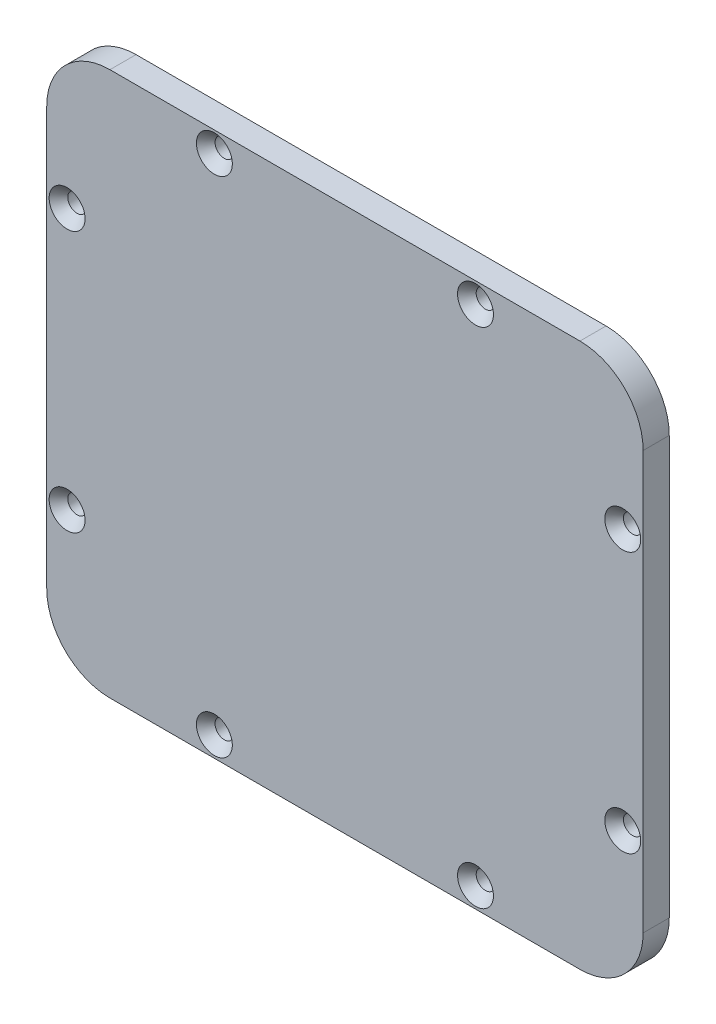
ISO-10303-21;
HEADER;
FILE_DESCRIPTION(('STEP AP214'),'2;1');
FILE_NAME('part.step','',(''),(''),'','','');
FILE_SCHEMA(('AUTOMOTIVE_DESIGN { 1 0 10303 214 1 1 1 1 }'));
ENDSEC;
DATA;
#1=APPLICATION_CONTEXT('core data for automotive mechanical design processes');
#2=APPLICATION_PROTOCOL_DEFINITION('international standard','automotive_design',2000,#1);
#3=PRODUCT_CONTEXT('',#1,'mechanical');
#4=PRODUCT('Part','Part','',(#3));
#5=PRODUCT_RELATED_PRODUCT_CATEGORY('part','',(#4));
#6=PRODUCT_DEFINITION_FORMATION('','',#4);
#7=PRODUCT_DEFINITION_CONTEXT('part definition',#1,'design');
#8=PRODUCT_DEFINITION('design','',#6,#7);
#9=PRODUCT_DEFINITION_SHAPE('','',#8);
#10=(LENGTH_UNIT() NAMED_UNIT(*) SI_UNIT(.MILLI.,.METRE.));
#11=(NAMED_UNIT(*) PLANE_ANGLE_UNIT() SI_UNIT($,.RADIAN.));
#12=(NAMED_UNIT(*) SI_UNIT($,.STERADIAN.) SOLID_ANGLE_UNIT());
#13=UNCERTAINTY_MEASURE_WITH_UNIT(LENGTH_MEASURE(1.E-05),#10,'distance_accuracy_value','');
#14=(GEOMETRIC_REPRESENTATION_CONTEXT(3) GLOBAL_UNCERTAINTY_ASSIGNED_CONTEXT((#13)) GLOBAL_UNIT_ASSIGNED_CONTEXT((#10,
#11,#12)) REPRESENTATION_CONTEXT('',''));
#15=CARTESIAN_POINT('',(0.,0.,0.));
#16=DIRECTION('',(0.,0.,1.));
#17=DIRECTION('',(1.,0.,0.));
#18=AXIS2_PLACEMENT_3D('',#15,#16,#17);
#19=CARTESIAN_POINT('',(-28.575,25.4,3.175));
#20=DIRECTION('',(0.,0.,-1.));
#21=DIRECTION('',(-1.,0.,0.));
#22=AXIS2_PLACEMENT_3D('',#19,#20,#21);
#23=CYLINDRICAL_SURFACE('',#22,7.6835);
#24=CARTESIAN_POINT('',(-28.575,25.4,0.));
#25=DIRECTION('',(0.,0.,1.));
#26=DIRECTION('',(1.,0.,0.));
#27=AXIS2_PLACEMENT_3D('',#24,#25,#26);
#28=CIRCLE('',#27,7.6835);
#29=CARTESIAN_POINT('',(-28.575,33.0835,0.));
#30=VERTEX_POINT('',#29);
#31=CARTESIAN_POINT('',(-36.2585,25.4,0.));
#32=VERTEX_POINT('',#31);
#33=EDGE_CURVE('E128',#30,#32,#28,.T.);
#34=ORIENTED_EDGE('',*,*,#33,.T.);
#35=DIRECTION('',(0.,0.,-1.));
#36=VECTOR('',#35,1.);
#37=CARTESIAN_POINT('',(-36.2585,25.4,3.175));
#38=LINE('',#37,#36);
#39=CARTESIAN_POINT('',(-36.2585,25.4,3.175));
#40=VERTEX_POINT('',#39);
#41=EDGE_CURVE('E11',#40,#32,#38,.T.);
#42=ORIENTED_EDGE('',*,*,#41,.F.);
#43=CARTESIAN_POINT('',(-28.575,25.4,3.175));
#44=DIRECTION('',(0.,0.,1.));
#45=DIRECTION('',(1.,0.,0.));
#46=AXIS2_PLACEMENT_3D('',#43,#44,#45);
#47=CIRCLE('',#46,7.6835);
#48=CARTESIAN_POINT('',(-28.575,33.0835,3.175));
#49=VERTEX_POINT('',#48);
#50=EDGE_CURVE('E143',#49,#40,#47,.T.);
#51=ORIENTED_EDGE('',*,*,#50,.F.);
#52=DIRECTION('',(0.,0.,-1.));
#53=VECTOR('',#52,1.);
#54=CARTESIAN_POINT('',(-28.575,33.0835,3.175));
#55=LINE('',#54,#53);
#56=EDGE_CURVE('E124',#49,#30,#55,.T.);
#57=ORIENTED_EDGE('',*,*,#56,.T.);
#58=EDGE_LOOP('',(#34,#42,#51,#57));
#59=FACE_BOUND('',#58,.T.);
#60=ADVANCED_FACE('F32',(#59),#23,.T.);
#61=CARTESIAN_POINT('',(-36.2585,25.4,3.175));
#62=DIRECTION('',(1.,0.,0.));
#63=DIRECTION('',(0.,1.,0.));
#64=AXIS2_PLACEMENT_3D('',#61,#62,#63);
#65=PLANE('',#64);
#66=DIRECTION('',(0.,-1.,0.));
#67=VECTOR('',#66,1.);
#68=CARTESIAN_POINT('',(-36.2585,25.4,0.));
#69=LINE('',#68,#67);
#70=CARTESIAN_POINT('',(-36.2585,-25.4,0.));
#71=VERTEX_POINT('',#70);
#72=EDGE_CURVE('E131',#32,#71,#69,.T.);
#73=ORIENTED_EDGE('',*,*,#72,.T.);
#74=DIRECTION('',(0.,0.,-1.));
#75=VECTOR('',#74,1.);
#76=CARTESIAN_POINT('',(-36.2585,-25.4,3.175));
#77=LINE('',#76,#75);
#78=CARTESIAN_POINT('',(-36.2585,-25.4,3.175));
#79=VERTEX_POINT('',#78);
#80=EDGE_CURVE('E40',#79,#71,#77,.T.);
#81=ORIENTED_EDGE('',*,*,#80,.F.);
#82=DIRECTION('',(0.,-1.,0.));
#83=VECTOR('',#82,1.);
#84=CARTESIAN_POINT('',(-36.2585,25.4,3.175));
#85=LINE('',#84,#83);
#86=EDGE_CURVE('E91',#40,#79,#85,.T.);
#87=ORIENTED_EDGE('',*,*,#86,.F.);
#88=ORIENTED_EDGE('',*,*,#41,.T.);
#89=EDGE_LOOP('',(#73,#81,#87,#88));
#90=FACE_BOUND('',#89,.T.);
#91=ADVANCED_FACE('F285',(#90),#65,.F.);
#92=CARTESIAN_POINT('',(-28.575,-25.4,3.175));
#93=DIRECTION('',(0.,0.,-1.));
#94=DIRECTION('',(-1.,0.,0.));
#95=AXIS2_PLACEMENT_3D('',#92,#93,#94);
#96=CYLINDRICAL_SURFACE('',#95,7.6835);
#97=CARTESIAN_POINT('',(-28.575,-25.4,0.));
#98=DIRECTION('',(0.,0.,1.));
#99=DIRECTION('',(1.,0.,0.));
#100=AXIS2_PLACEMENT_3D('',#97,#98,#99);
#101=CIRCLE('',#100,7.6835);
#102=CARTESIAN_POINT('',(-28.575,-33.0835,0.));
#103=VERTEX_POINT('',#102);
#104=EDGE_CURVE('E134',#71,#103,#101,.T.);
#105=ORIENTED_EDGE('',*,*,#104,.T.);
#106=DIRECTION('',(0.,0.,-1.));
#107=VECTOR('',#106,1.);
#108=CARTESIAN_POINT('',(-28.575,-33.0835,3.175));
#109=LINE('',#108,#107);
#110=CARTESIAN_POINT('',(-28.575,-33.0835,3.175));
#111=VERTEX_POINT('',#110);
#112=EDGE_CURVE('E150',#111,#103,#109,.T.);
#113=ORIENTED_EDGE('',*,*,#112,.F.);
#114=CARTESIAN_POINT('',(-28.575,-25.4,3.175));
#115=DIRECTION('',(0.,0.,1.));
#116=DIRECTION('',(1.,0.,0.));
#117=AXIS2_PLACEMENT_3D('',#114,#115,#116);
#118=CIRCLE('',#117,7.6835);
#119=EDGE_CURVE('E158',#79,#111,#118,.T.);
#120=ORIENTED_EDGE('',*,*,#119,.F.);
#121=ORIENTED_EDGE('',*,*,#80,.T.);
#122=EDGE_LOOP('',(#105,#113,#120,#121));
#123=FACE_BOUND('',#122,.T.);
#124=ADVANCED_FACE('F156',(#123),#96,.T.);
#125=CARTESIAN_POINT('',(-28.575,-33.0835,3.175));
#126=DIRECTION('',(0.,1.,0.));
#127=DIRECTION('',(-1.,0.,0.));
#128=AXIS2_PLACEMENT_3D('',#125,#126,#127);
#129=PLANE('',#128);
#130=DIRECTION('',(1.,0.,0.));
#131=VECTOR('',#130,1.);
#132=CARTESIAN_POINT('',(-28.575,-33.0835,0.));
#133=LINE('',#132,#131);
#134=CARTESIAN_POINT('',(28.575,-33.0835,0.));
#135=VERTEX_POINT('',#134);
#136=EDGE_CURVE('E136',#103,#135,#133,.T.);
#137=ORIENTED_EDGE('',*,*,#136,.T.);
#138=DIRECTION('',(0.,0.,-1.));
#139=VECTOR('',#138,1.);
#140=CARTESIAN_POINT('',(28.575,-33.0835,3.175));
#141=LINE('',#140,#139);
#142=CARTESIAN_POINT('',(28.575,-33.0835,3.175));
#143=VERTEX_POINT('',#142);
#144=EDGE_CURVE('E147',#143,#135,#141,.T.);
#145=ORIENTED_EDGE('',*,*,#144,.F.);
#146=DIRECTION('',(1.,0.,0.));
#147=VECTOR('',#146,1.);
#148=CARTESIAN_POINT('',(-28.575,-33.0835,3.175));
#149=LINE('',#148,#147);
#150=EDGE_CURVE('E170',#111,#143,#149,.T.);
#151=ORIENTED_EDGE('',*,*,#150,.F.);
#152=ORIENTED_EDGE('',*,*,#112,.T.);
#153=EDGE_LOOP('',(#137,#145,#151,#152));
#154=FACE_BOUND('',#153,.T.);
#155=ADVANCED_FACE('F166',(#154),#129,.F.);
#156=CARTESIAN_POINT('',(28.575,-25.4,3.175));
#157=DIRECTION('',(0.,0.,-1.));
#158=DIRECTION('',(-1.,0.,0.));
#159=AXIS2_PLACEMENT_3D('',#156,#157,#158);
#160=CYLINDRICAL_SURFACE('',#159,7.6835);
#161=CARTESIAN_POINT('',(28.575,-25.4,0.));
#162=DIRECTION('',(0.,0.,1.));
#163=DIRECTION('',(1.,0.,0.));
#164=AXIS2_PLACEMENT_3D('',#161,#162,#163);
#165=CIRCLE('',#164,7.6835);
#166=CARTESIAN_POINT('',(36.2585,-25.4,0.));
#167=VERTEX_POINT('',#166);
#168=EDGE_CURVE('E138',#135,#167,#165,.T.);
#169=ORIENTED_EDGE('',*,*,#168,.T.);
#170=DIRECTION('',(0.,0.,-1.));
#171=VECTOR('',#170,1.);
#172=CARTESIAN_POINT('',(36.2585,-25.4,3.175));
#173=LINE('',#172,#171);
#174=CARTESIAN_POINT('',(36.2585,-25.4,3.175));
#175=VERTEX_POINT('',#174);
#176=EDGE_CURVE('E119',#175,#167,#173,.T.);
#177=ORIENTED_EDGE('',*,*,#176,.F.);
#178=CARTESIAN_POINT('',(28.575,-25.4,3.175));
#179=DIRECTION('',(0.,0.,1.));
#180=DIRECTION('',(1.,0.,0.));
#181=AXIS2_PLACEMENT_3D('',#178,#179,#180);
#182=CIRCLE('',#181,7.6835);
#183=EDGE_CURVE('E110',#143,#175,#182,.T.);
#184=ORIENTED_EDGE('',*,*,#183,.F.);
#185=ORIENTED_EDGE('',*,*,#144,.T.);
#186=EDGE_LOOP('',(#169,#177,#184,#185));
#187=FACE_BOUND('',#186,.T.);
#188=ADVANCED_FACE('F169',(#187),#160,.T.);
#189=CARTESIAN_POINT('',(36.2585,-25.4,3.175));
#190=DIRECTION('',(-1.,0.,0.));
#191=DIRECTION('',(0.,-1.,0.));
#192=AXIS2_PLACEMENT_3D('',#189,#190,#191);
#193=PLANE('',#192);
#194=DIRECTION('',(0.,1.,0.));
#195=VECTOR('',#194,1.);
#196=CARTESIAN_POINT('',(36.2585,-25.4,0.));
#197=LINE('',#196,#195);
#198=CARTESIAN_POINT('',(36.2585,25.4,0.));
#199=VERTEX_POINT('',#198);
#200=EDGE_CURVE('E118',#167,#199,#197,.T.);
#201=ORIENTED_EDGE('',*,*,#200,.T.);
#202=DIRECTION('',(0.,0.,-1.));
#203=VECTOR('',#202,1.);
#204=CARTESIAN_POINT('',(36.2585,25.4,3.175));
#205=LINE('',#204,#203);
#206=CARTESIAN_POINT('',(36.2585,25.4,3.175));
#207=VERTEX_POINT('',#206);
#208=EDGE_CURVE('E115',#207,#199,#205,.T.);
#209=ORIENTED_EDGE('',*,*,#208,.F.);
#210=DIRECTION('',(0.,1.,0.));
#211=VECTOR('',#210,1.);
#212=CARTESIAN_POINT('',(36.2585,-25.4,3.175));
#213=LINE('',#212,#211);
#214=EDGE_CURVE('E104',#175,#207,#213,.T.);
#215=ORIENTED_EDGE('',*,*,#214,.F.);
#216=ORIENTED_EDGE('',*,*,#176,.T.);
#217=EDGE_LOOP('',(#201,#209,#215,#216));
#218=FACE_BOUND('',#217,.T.);
#219=ADVANCED_FACE('F116',(#218),#193,.F.);
#220=CARTESIAN_POINT('',(28.575,25.4,3.175));
#221=DIRECTION('',(0.,0.,-1.));
#222=DIRECTION('',(-1.,0.,0.));
#223=AXIS2_PLACEMENT_3D('',#220,#221,#222);
#224=CYLINDRICAL_SURFACE('',#223,7.6835);
#225=CARTESIAN_POINT('',(28.575,25.4,0.));
#226=DIRECTION('',(0.,0.,1.));
#227=DIRECTION('',(1.,0.,0.));
#228=AXIS2_PLACEMENT_3D('',#225,#226,#227);
#229=CIRCLE('',#228,7.6835);
#230=CARTESIAN_POINT('',(28.575,33.0835,0.));
#231=VERTEX_POINT('',#230);
#232=EDGE_CURVE('E77',#199,#231,#229,.T.);
#233=ORIENTED_EDGE('',*,*,#232,.T.);
#234=DIRECTION('',(0.,0.,-1.));
#235=VECTOR('',#234,1.);
#236=CARTESIAN_POINT('',(28.575,33.0835,3.175));
#237=LINE('',#236,#235);
#238=CARTESIAN_POINT('',(28.575,33.0835,3.175));
#239=VERTEX_POINT('',#238);
#240=EDGE_CURVE('E120',#239,#231,#237,.T.);
#241=ORIENTED_EDGE('',*,*,#240,.F.);
#242=CARTESIAN_POINT('',(28.575,25.4,3.175));
#243=DIRECTION('',(0.,0.,1.));
#244=DIRECTION('',(1.,0.,0.));
#245=AXIS2_PLACEMENT_3D('',#242,#243,#244);
#246=CIRCLE('',#245,7.6835);
#247=EDGE_CURVE('E108',#207,#239,#246,.T.);
#248=ORIENTED_EDGE('',*,*,#247,.F.);
#249=ORIENTED_EDGE('',*,*,#208,.T.);
#250=EDGE_LOOP('',(#233,#241,#248,#249));
#251=FACE_BOUND('',#250,.T.);
#252=ADVANCED_FACE('F122',(#251),#224,.T.);
#253=CARTESIAN_POINT('',(28.575,33.0835,3.175));
#254=DIRECTION('',(0.,-1.,0.));
#255=DIRECTION('',(0.,0.,-1.));
#256=AXIS2_PLACEMENT_3D('',#253,#254,#255);
#257=PLANE('',#256);
#258=DIRECTION('',(-1.,0.,0.));
#259=VECTOR('',#258,1.);
#260=CARTESIAN_POINT('',(28.575,33.0835,0.));
#261=LINE('',#260,#259);
#262=EDGE_CURVE('E83',#231,#30,#261,.T.);
#263=ORIENTED_EDGE('',*,*,#262,.T.);
#264=ORIENTED_EDGE('',*,*,#56,.F.);
#265=DIRECTION('',(-1.,0.,0.));
#266=VECTOR('',#265,1.);
#267=CARTESIAN_POINT('',(28.575,33.0835,3.175));
#268=LINE('',#267,#266);
#269=EDGE_CURVE('E48',#239,#49,#268,.T.);
#270=ORIENTED_EDGE('',*,*,#269,.F.);
#271=ORIENTED_EDGE('',*,*,#240,.T.);
#272=EDGE_LOOP('',(#263,#264,#270,#271));
#273=FACE_BOUND('',#272,.T.);
#274=ADVANCED_FACE('F252',(#273),#257,.F.);
#275=CARTESIAN_POINT('',(-28.575,25.4,3.175));
#276=DIRECTION('',(0.,0.,1.));
#277=DIRECTION('',(1.,0.,0.));
#278=AXIS2_PLACEMENT_3D('',#275,#276,#277);
#279=PLANE('',#278);
#280=CARTESIAN_POINT('',(-15.875,30.607,3.175));
#281=DIRECTION('',(0.,0.,1.));
#282=DIRECTION('',(1.,0.,0.));
#283=AXIS2_PLACEMENT_3D('',#280,#281,#282);
#284=CIRCLE('',#283,2.1844);
#285=CARTESIAN_POINT('',(-13.6906,30.607,3.175));
#286=VERTEX_POINT('',#285);
#287=EDGE_CURVE('E244',#286,#286,#284,.T.);
#288=ORIENTED_EDGE('',*,*,#287,.F.);
#289=EDGE_LOOP('',(#288));
#290=FACE_BOUND('',#289,.T.);
#291=CARTESIAN_POINT('',(-33.782,15.875,3.175));
#292=DIRECTION('',(0.,0.,1.));
#293=DIRECTION('',(1.,0.,0.));
#294=AXIS2_PLACEMENT_3D('',#291,#292,#293);
#295=CIRCLE('',#294,2.1844);
#296=CARTESIAN_POINT('',(-31.5976,15.875,3.175));
#297=VERTEX_POINT('',#296);
#298=EDGE_CURVE('E235',#297,#297,#295,.T.);
#299=ORIENTED_EDGE('',*,*,#298,.F.);
#300=EDGE_LOOP('',(#299));
#301=FACE_BOUND('',#300,.T.);
#302=CARTESIAN_POINT('',(-33.782,-15.875,3.175));
#303=DIRECTION('',(0.,0.,1.));
#304=DIRECTION('',(1.,0.,0.));
#305=AXIS2_PLACEMENT_3D('',#302,#303,#304);
#306=CIRCLE('',#305,2.1844);
#307=CARTESIAN_POINT('',(-31.5976,-15.875,3.175));
#308=VERTEX_POINT('',#307);
#309=EDGE_CURVE('E226',#308,#308,#306,.T.);
#310=ORIENTED_EDGE('',*,*,#309,.F.);
#311=EDGE_LOOP('',(#310));
#312=FACE_BOUND('',#311,.T.);
#313=CARTESIAN_POINT('',(-15.875,-30.607,3.175));
#314=DIRECTION('',(0.,0.,1.));
#315=DIRECTION('',(1.,0.,0.));
#316=AXIS2_PLACEMENT_3D('',#313,#314,#315);
#317=CIRCLE('',#316,2.1844);
#318=CARTESIAN_POINT('',(-13.6906,-30.607,3.175));
#319=VERTEX_POINT('',#318);
#320=EDGE_CURVE('E217',#319,#319,#317,.T.);
#321=ORIENTED_EDGE('',*,*,#320,.F.);
#322=EDGE_LOOP('',(#321));
#323=FACE_BOUND('',#322,.T.);
#324=CARTESIAN_POINT('',(15.875,-30.607,3.175));
#325=DIRECTION('',(0.,0.,1.));
#326=DIRECTION('',(1.,0.,0.));
#327=AXIS2_PLACEMENT_3D('',#324,#325,#326);
#328=CIRCLE('',#327,2.1844);
#329=CARTESIAN_POINT('',(18.0594,-30.607,3.175));
#330=VERTEX_POINT('',#329);
#331=EDGE_CURVE('E208',#330,#330,#328,.T.);
#332=ORIENTED_EDGE('',*,*,#331,.F.);
#333=EDGE_LOOP('',(#332));
#334=FACE_BOUND('',#333,.T.);
#335=CARTESIAN_POINT('',(33.782,-15.875,3.175));
#336=DIRECTION('',(0.,0.,1.));
#337=DIRECTION('',(1.,0.,0.));
#338=AXIS2_PLACEMENT_3D('',#335,#336,#337);
#339=CIRCLE('',#338,2.1844);
#340=CARTESIAN_POINT('',(35.9664,-15.875,3.175));
#341=VERTEX_POINT('',#340);
#342=EDGE_CURVE('E199',#341,#341,#339,.T.);
#343=ORIENTED_EDGE('',*,*,#342,.F.);
#344=EDGE_LOOP('',(#343));
#345=FACE_BOUND('',#344,.T.);
#346=CARTESIAN_POINT('',(33.782,15.875,3.175));
#347=DIRECTION('',(0.,0.,1.));
#348=DIRECTION('',(1.,0.,0.));
#349=AXIS2_PLACEMENT_3D('',#346,#347,#348);
#350=CIRCLE('',#349,2.1844);
#351=CARTESIAN_POINT('',(35.9664,15.875,3.175));
#352=VERTEX_POINT('',#351);
#353=EDGE_CURVE('E190',#352,#352,#350,.T.);
#354=ORIENTED_EDGE('',*,*,#353,.F.);
#355=EDGE_LOOP('',(#354));
#356=FACE_BOUND('',#355,.T.);
#357=CARTESIAN_POINT('',(15.875,30.607,3.175));
#358=DIRECTION('',(0.,0.,1.));
#359=DIRECTION('',(1.,0.,0.));
#360=AXIS2_PLACEMENT_3D('',#357,#358,#359);
#361=CIRCLE('',#360,2.1844);
#362=CARTESIAN_POINT('',(18.0594,30.607,3.175));
#363=VERTEX_POINT('',#362);
#364=EDGE_CURVE('E181',#363,#363,#361,.T.);
#365=ORIENTED_EDGE('',*,*,#364,.F.);
#366=EDGE_LOOP('',(#365));
#367=FACE_BOUND('',#366,.T.);
#368=ORIENTED_EDGE('',*,*,#50,.T.);
#369=ORIENTED_EDGE('',*,*,#86,.T.);
#370=ORIENTED_EDGE('',*,*,#119,.T.);
#371=ORIENTED_EDGE('',*,*,#150,.T.);
#372=ORIENTED_EDGE('',*,*,#183,.T.);
#373=ORIENTED_EDGE('',*,*,#214,.T.);
#374=ORIENTED_EDGE('',*,*,#247,.T.);
#375=ORIENTED_EDGE('',*,*,#269,.T.);
#376=EDGE_LOOP('',(#368,#369,#370,#371,#372,#373,#374,#375));
#377=FACE_BOUND('',#376,.T.);
#378=ADVANCED_FACE('F106',(#290,#301,#312,#323,#334,#345,#356,#367,#377),#279,.T.);
#379=CARTESIAN_POINT('',(-28.575,25.4,0.));
#380=DIRECTION('',(0.,0.,1.));
#381=DIRECTION('',(1.,0.,0.));
#382=AXIS2_PLACEMENT_3D('',#379,#380,#381);
#383=PLANE('',#382);
#384=CARTESIAN_POINT('',(-15.875,30.607,0.));
#385=DIRECTION('',(0.,0.,1.));
#386=DIRECTION('',(1.,0.,0.));
#387=AXIS2_PLACEMENT_3D('',#384,#385,#386);
#388=CIRCLE('',#387,1.1303);
#389=CARTESIAN_POINT('',(-14.7447,30.607,0.));
#390=VERTEX_POINT('',#389);
#391=EDGE_CURVE('E238',#390,#390,#388,.T.);
#392=ORIENTED_EDGE('',*,*,#391,.T.);
#393=EDGE_LOOP('',(#392));
#394=FACE_BOUND('',#393,.T.);
#395=CARTESIAN_POINT('',(-33.782,15.875,0.));
#396=DIRECTION('',(0.,0.,1.));
#397=DIRECTION('',(1.,0.,0.));
#398=AXIS2_PLACEMENT_3D('',#395,#396,#397);
#399=CIRCLE('',#398,1.13029999999999);
#400=CARTESIAN_POINT('',(-32.6517,15.875,0.));
#401=VERTEX_POINT('',#400);
#402=EDGE_CURVE('E229',#401,#401,#399,.T.);
#403=ORIENTED_EDGE('',*,*,#402,.T.);
#404=EDGE_LOOP('',(#403));
#405=FACE_BOUND('',#404,.T.);
#406=CARTESIAN_POINT('',(-33.782,-15.875,0.));
#407=DIRECTION('',(0.,0.,1.));
#408=DIRECTION('',(1.,0.,0.));
#409=AXIS2_PLACEMENT_3D('',#406,#407,#408);
#410=CIRCLE('',#409,1.13029999999999);
#411=CARTESIAN_POINT('',(-32.6517,-15.875,0.));
#412=VERTEX_POINT('',#411);
#413=EDGE_CURVE('E220',#412,#412,#410,.T.);
#414=ORIENTED_EDGE('',*,*,#413,.T.);
#415=EDGE_LOOP('',(#414));
#416=FACE_BOUND('',#415,.T.);
#417=CARTESIAN_POINT('',(-15.875,-30.607,0.));
#418=DIRECTION('',(0.,0.,1.));
#419=DIRECTION('',(1.,0.,0.));
#420=AXIS2_PLACEMENT_3D('',#417,#418,#419);
#421=CIRCLE('',#420,1.1303);
#422=CARTESIAN_POINT('',(-14.7447,-30.607,0.));
#423=VERTEX_POINT('',#422);
#424=EDGE_CURVE('E211',#423,#423,#421,.T.);
#425=ORIENTED_EDGE('',*,*,#424,.T.);
#426=EDGE_LOOP('',(#425));
#427=FACE_BOUND('',#426,.T.);
#428=CARTESIAN_POINT('',(15.875,-30.607,0.));
#429=DIRECTION('',(0.,0.,1.));
#430=DIRECTION('',(1.,0.,0.));
#431=AXIS2_PLACEMENT_3D('',#428,#429,#430);
#432=CIRCLE('',#431,1.1303);
#433=CARTESIAN_POINT('',(17.0053,-30.607,0.));
#434=VERTEX_POINT('',#433);
#435=EDGE_CURVE('E202',#434,#434,#432,.T.);
#436=ORIENTED_EDGE('',*,*,#435,.T.);
#437=EDGE_LOOP('',(#436));
#438=FACE_BOUND('',#437,.T.);
#439=CARTESIAN_POINT('',(33.782,-15.875,0.));
#440=DIRECTION('',(0.,0.,1.));
#441=DIRECTION('',(1.,0.,0.));
#442=AXIS2_PLACEMENT_3D('',#439,#440,#441);
#443=CIRCLE('',#442,1.13029999999999);
#444=CARTESIAN_POINT('',(34.9123,-15.875,0.));
#445=VERTEX_POINT('',#444);
#446=EDGE_CURVE('E193',#445,#445,#443,.T.);
#447=ORIENTED_EDGE('',*,*,#446,.T.);
#448=EDGE_LOOP('',(#447));
#449=FACE_BOUND('',#448,.T.);
#450=CARTESIAN_POINT('',(33.782,15.875,0.));
#451=DIRECTION('',(0.,0.,1.));
#452=DIRECTION('',(1.,0.,0.));
#453=AXIS2_PLACEMENT_3D('',#450,#451,#452);
#454=CIRCLE('',#453,1.13029999999999);
#455=CARTESIAN_POINT('',(34.9123,15.875,0.));
#456=VERTEX_POINT('',#455);
#457=EDGE_CURVE('E184',#456,#456,#454,.T.);
#458=ORIENTED_EDGE('',*,*,#457,.T.);
#459=EDGE_LOOP('',(#458));
#460=FACE_BOUND('',#459,.T.);
#461=CARTESIAN_POINT('',(15.875,30.607,0.));
#462=DIRECTION('',(0.,0.,1.));
#463=DIRECTION('',(1.,0.,0.));
#464=AXIS2_PLACEMENT_3D('',#461,#462,#463);
#465=CIRCLE('',#464,1.1303);
#466=CARTESIAN_POINT('',(17.0053,30.607,0.));
#467=VERTEX_POINT('',#466);
#468=EDGE_CURVE('E132',#467,#467,#465,.T.);
#469=ORIENTED_EDGE('',*,*,#468,.T.);
#470=EDGE_LOOP('',(#469));
#471=FACE_BOUND('',#470,.T.);
#472=ORIENTED_EDGE('',*,*,#33,.F.);
#473=ORIENTED_EDGE('',*,*,#262,.F.);
#474=ORIENTED_EDGE('',*,*,#232,.F.);
#475=ORIENTED_EDGE('',*,*,#200,.F.);
#476=ORIENTED_EDGE('',*,*,#168,.F.);
#477=ORIENTED_EDGE('',*,*,#136,.F.);
#478=ORIENTED_EDGE('',*,*,#104,.F.);
#479=ORIENTED_EDGE('',*,*,#72,.F.);
#480=EDGE_LOOP('',(#472,#473,#474,#475,#476,#477,#478,#479));
#481=FACE_BOUND('',#480,.T.);
#482=ADVANCED_FACE('F162',(#394,#405,#416,#427,#438,#449,#460,#471,#481),#383,.F.);
#483=CARTESIAN_POINT('',(15.875,30.607,3.175));
#484=DIRECTION('',(0.,0.,1.));
#485=DIRECTION('',(1.,0.,0.));
#486=AXIS2_PLACEMENT_3D('',#483,#484,#485);
#487=CYLINDRICAL_SURFACE('',#486,1.1303);
#488=ORIENTED_EDGE('',*,*,#468,.F.);
#489=EDGE_LOOP('',(#488));
#490=FACE_BOUND('',#489,.T.);
#491=CARTESIAN_POINT('',(15.875,30.607,1.96239666194833));
#492=DIRECTION('',(0.,0.,1.));
#493=DIRECTION('',(1.,0.,0.));
#494=AXIS2_PLACEMENT_3D('',#491,#492,#493);
#495=CIRCLE('',#494,1.1303);
#496=CARTESIAN_POINT('',(17.0053,30.607,1.96239666194833));
#497=VERTEX_POINT('',#496);
#498=EDGE_CURVE('E178',#497,#497,#495,.T.);
#499=ORIENTED_EDGE('',*,*,#498,.T.);
#500=EDGE_LOOP('',(#499));
#501=FACE_BOUND('',#500,.T.);
#502=ADVANCED_FACE('F271',(#490,#501),#487,.F.);
#503=CARTESIAN_POINT('',(15.875,30.607,3.175));
#504=DIRECTION('',(0.,0.,1.));
#505=DIRECTION('',(1.,0.,0.));
#506=AXIS2_PLACEMENT_3D('',#503,#504,#505);
#507=CONICAL_SURFACE('',#506,2.1844,0.715584993317676);
#508=ORIENTED_EDGE('',*,*,#498,.F.);
#509=EDGE_LOOP('',(#508));
#510=FACE_BOUND('',#509,.T.);
#511=ORIENTED_EDGE('',*,*,#364,.T.);
#512=EDGE_LOOP('',(#511));
#513=FACE_BOUND('',#512,.T.);
#514=ADVANCED_FACE('F268',(#510,#513),#507,.F.);
#515=CARTESIAN_POINT('',(33.782,15.875,3.175));
#516=DIRECTION('',(0.,0.,1.));
#517=DIRECTION('',(1.,0.,0.));
#518=AXIS2_PLACEMENT_3D('',#515,#516,#517);
#519=CYLINDRICAL_SURFACE('',#518,1.1303);
#520=ORIENTED_EDGE('',*,*,#457,.F.);
#521=EDGE_LOOP('',(#520));
#522=FACE_BOUND('',#521,.T.);
#523=CARTESIAN_POINT('',(33.782,15.875,1.96239666194833));
#524=DIRECTION('',(0.,0.,1.));
#525=DIRECTION('',(1.,0.,0.));
#526=AXIS2_PLACEMENT_3D('',#523,#524,#525);
#527=CIRCLE('',#526,1.1303);
#528=CARTESIAN_POINT('',(34.9123,15.875,1.96239666194833));
#529=VERTEX_POINT('',#528);
#530=EDGE_CURVE('E187',#529,#529,#527,.T.);
#531=ORIENTED_EDGE('',*,*,#530,.T.);
#532=EDGE_LOOP('',(#531));
#533=FACE_BOUND('',#532,.T.);
#534=ADVANCED_FACE('F270',(#522,#533),#519,.F.);
#535=CARTESIAN_POINT('',(33.782,15.875,3.175));
#536=DIRECTION('',(0.,0.,1.));
#537=DIRECTION('',(1.,0.,0.));
#538=AXIS2_PLACEMENT_3D('',#535,#536,#537);
#539=CONICAL_SURFACE('',#538,2.1844,0.715584993317676);
#540=ORIENTED_EDGE('',*,*,#530,.F.);
#541=EDGE_LOOP('',(#540));
#542=FACE_BOUND('',#541,.T.);
#543=ORIENTED_EDGE('',*,*,#353,.T.);
#544=EDGE_LOOP('',(#543));
#545=FACE_BOUND('',#544,.T.);
#546=ADVANCED_FACE('F278',(#542,#545),#539,.F.);
#547=CARTESIAN_POINT('',(33.782,-15.875,3.175));
#548=DIRECTION('',(0.,0.,1.));
#549=DIRECTION('',(1.,0.,0.));
#550=AXIS2_PLACEMENT_3D('',#547,#548,#549);
#551=CYLINDRICAL_SURFACE('',#550,1.1303);
#552=ORIENTED_EDGE('',*,*,#446,.F.);
#553=EDGE_LOOP('',(#552));
#554=FACE_BOUND('',#553,.T.);
#555=CARTESIAN_POINT('',(33.782,-15.875,1.96239666194833));
#556=DIRECTION('',(0.,0.,1.));
#557=DIRECTION('',(1.,0.,0.));
#558=AXIS2_PLACEMENT_3D('',#555,#556,#557);
#559=CIRCLE('',#558,1.1303);
#560=CARTESIAN_POINT('',(34.9123,-15.875,1.96239666194833));
#561=VERTEX_POINT('',#560);
#562=EDGE_CURVE('E196',#561,#561,#559,.T.);
#563=ORIENTED_EDGE('',*,*,#562,.T.);
#564=EDGE_LOOP('',(#563));
#565=FACE_BOUND('',#564,.T.);
#566=ADVANCED_FACE('F370',(#554,#565),#551,.F.);
#567=CARTESIAN_POINT('',(33.782,-15.875,3.175));
#568=DIRECTION('',(0.,0.,1.));
#569=DIRECTION('',(1.,0.,0.));
#570=AXIS2_PLACEMENT_3D('',#567,#568,#569);
#571=CONICAL_SURFACE('',#570,2.1844,0.715584993317676);
#572=ORIENTED_EDGE('',*,*,#562,.F.);
#573=EDGE_LOOP('',(#572));
#574=FACE_BOUND('',#573,.T.);
#575=ORIENTED_EDGE('',*,*,#342,.T.);
#576=EDGE_LOOP('',(#575));
#577=FACE_BOUND('',#576,.T.);
#578=ADVANCED_FACE('F380',(#574,#577),#571,.F.);
#579=CARTESIAN_POINT('',(15.875,-30.607,3.175));
#580=DIRECTION('',(0.,0.,1.));
#581=DIRECTION('',(1.,0.,0.));
#582=AXIS2_PLACEMENT_3D('',#579,#580,#581);
#583=CYLINDRICAL_SURFACE('',#582,1.1303);
#584=ORIENTED_EDGE('',*,*,#435,.F.);
#585=EDGE_LOOP('',(#584));
#586=FACE_BOUND('',#585,.T.);
#587=CARTESIAN_POINT('',(15.875,-30.607,1.96239666194833));
#588=DIRECTION('',(0.,0.,1.));
#589=DIRECTION('',(1.,0.,0.));
#590=AXIS2_PLACEMENT_3D('',#587,#588,#589);
#591=CIRCLE('',#590,1.1303);
#592=CARTESIAN_POINT('',(17.0053,-30.607,1.96239666194833));
#593=VERTEX_POINT('',#592);
#594=EDGE_CURVE('E205',#593,#593,#591,.T.);
#595=ORIENTED_EDGE('',*,*,#594,.T.);
#596=EDGE_LOOP('',(#595));
#597=FACE_BOUND('',#596,.T.);
#598=ADVANCED_FACE('F390',(#586,#597),#583,.F.);
#599=CARTESIAN_POINT('',(15.875,-30.607,3.175));
#600=DIRECTION('',(0.,0.,1.));
#601=DIRECTION('',(1.,0.,0.));
#602=AXIS2_PLACEMENT_3D('',#599,#600,#601);
#603=CONICAL_SURFACE('',#602,2.1844,0.715584993317676);
#604=ORIENTED_EDGE('',*,*,#594,.F.);
#605=EDGE_LOOP('',(#604));
#606=FACE_BOUND('',#605,.T.);
#607=ORIENTED_EDGE('',*,*,#331,.T.);
#608=EDGE_LOOP('',(#607));
#609=FACE_BOUND('',#608,.T.);
#610=ADVANCED_FACE('F400',(#606,#609),#603,.F.);
#611=CARTESIAN_POINT('',(-15.875,-30.607,3.175));
#612=DIRECTION('',(0.,0.,1.));
#613=DIRECTION('',(1.,0.,0.));
#614=AXIS2_PLACEMENT_3D('',#611,#612,#613);
#615=CYLINDRICAL_SURFACE('',#614,1.1303);
#616=ORIENTED_EDGE('',*,*,#424,.F.);
#617=EDGE_LOOP('',(#616));
#618=FACE_BOUND('',#617,.T.);
#619=CARTESIAN_POINT('',(-15.875,-30.607,1.96239666194833));
#620=DIRECTION('',(0.,0.,1.));
#621=DIRECTION('',(1.,0.,0.));
#622=AXIS2_PLACEMENT_3D('',#619,#620,#621);
#623=CIRCLE('',#622,1.1303);
#624=CARTESIAN_POINT('',(-14.7447,-30.607,1.96239666194833));
#625=VERTEX_POINT('',#624);
#626=EDGE_CURVE('E214',#625,#625,#623,.T.);
#627=ORIENTED_EDGE('',*,*,#626,.T.);
#628=EDGE_LOOP('',(#627));
#629=FACE_BOUND('',#628,.T.);
#630=ADVANCED_FACE('F410',(#618,#629),#615,.F.);
#631=CARTESIAN_POINT('',(-15.875,-30.607,3.175));
#632=DIRECTION('',(0.,0.,1.));
#633=DIRECTION('',(1.,0.,0.));
#634=AXIS2_PLACEMENT_3D('',#631,#632,#633);
#635=CONICAL_SURFACE('',#634,2.1844,0.715584993317675);
#636=ORIENTED_EDGE('',*,*,#626,.F.);
#637=EDGE_LOOP('',(#636));
#638=FACE_BOUND('',#637,.T.);
#639=ORIENTED_EDGE('',*,*,#320,.T.);
#640=EDGE_LOOP('',(#639));
#641=FACE_BOUND('',#640,.T.);
#642=ADVANCED_FACE('F420',(#638,#641),#635,.F.);
#643=CARTESIAN_POINT('',(-33.782,-15.875,3.175));
#644=DIRECTION('',(0.,0.,1.));
#645=DIRECTION('',(1.,0.,0.));
#646=AXIS2_PLACEMENT_3D('',#643,#644,#645);
#647=CYLINDRICAL_SURFACE('',#646,1.1303);
#648=ORIENTED_EDGE('',*,*,#413,.F.);
#649=EDGE_LOOP('',(#648));
#650=FACE_BOUND('',#649,.T.);
#651=CARTESIAN_POINT('',(-33.782,-15.875,1.96239666194833));
#652=DIRECTION('',(0.,0.,1.));
#653=DIRECTION('',(1.,0.,0.));
#654=AXIS2_PLACEMENT_3D('',#651,#652,#653);
#655=CIRCLE('',#654,1.1303);
#656=CARTESIAN_POINT('',(-32.6517,-15.875,1.96239666194833));
#657=VERTEX_POINT('',#656);
#658=EDGE_CURVE('E223',#657,#657,#655,.T.);
#659=ORIENTED_EDGE('',*,*,#658,.T.);
#660=EDGE_LOOP('',(#659));
#661=FACE_BOUND('',#660,.T.);
#662=ADVANCED_FACE('F430',(#650,#661),#647,.F.);
#663=CARTESIAN_POINT('',(-33.782,-15.875,3.175));
#664=DIRECTION('',(0.,0.,1.));
#665=DIRECTION('',(1.,0.,0.));
#666=AXIS2_PLACEMENT_3D('',#663,#664,#665);
#667=CONICAL_SURFACE('',#666,2.1844,0.715584993317676);
#668=ORIENTED_EDGE('',*,*,#658,.F.);
#669=EDGE_LOOP('',(#668));
#670=FACE_BOUND('',#669,.T.);
#671=ORIENTED_EDGE('',*,*,#309,.T.);
#672=EDGE_LOOP('',(#671));
#673=FACE_BOUND('',#672,.T.);
#674=ADVANCED_FACE('F440',(#670,#673),#667,.F.);
#675=CARTESIAN_POINT('',(-33.782,15.875,3.175));
#676=DIRECTION('',(0.,0.,1.));
#677=DIRECTION('',(1.,0.,0.));
#678=AXIS2_PLACEMENT_3D('',#675,#676,#677);
#679=CYLINDRICAL_SURFACE('',#678,1.1303);
#680=ORIENTED_EDGE('',*,*,#402,.F.);
#681=EDGE_LOOP('',(#680));
#682=FACE_BOUND('',#681,.T.);
#683=CARTESIAN_POINT('',(-33.782,15.875,1.96239666194833));
#684=DIRECTION('',(0.,0.,1.));
#685=DIRECTION('',(1.,0.,0.));
#686=AXIS2_PLACEMENT_3D('',#683,#684,#685);
#687=CIRCLE('',#686,1.1303);
#688=CARTESIAN_POINT('',(-32.6517,15.875,1.96239666194833));
#689=VERTEX_POINT('',#688);
#690=EDGE_CURVE('E232',#689,#689,#687,.T.);
#691=ORIENTED_EDGE('',*,*,#690,.T.);
#692=EDGE_LOOP('',(#691));
#693=FACE_BOUND('',#692,.T.);
#694=ADVANCED_FACE('F450',(#682,#693),#679,.F.);
#695=CARTESIAN_POINT('',(-33.782,15.875,3.175));
#696=DIRECTION('',(0.,0.,1.));
#697=DIRECTION('',(1.,0.,0.));
#698=AXIS2_PLACEMENT_3D('',#695,#696,#697);
#699=CONICAL_SURFACE('',#698,2.1844,0.715584993317676);
#700=ORIENTED_EDGE('',*,*,#690,.F.);
#701=EDGE_LOOP('',(#700));
#702=FACE_BOUND('',#701,.T.);
#703=ORIENTED_EDGE('',*,*,#298,.T.);
#704=EDGE_LOOP('',(#703));
#705=FACE_BOUND('',#704,.T.);
#706=ADVANCED_FACE('F460',(#702,#705),#699,.F.);
#707=CARTESIAN_POINT('',(-15.875,30.607,3.175));
#708=DIRECTION('',(0.,0.,1.));
#709=DIRECTION('',(1.,0.,0.));
#710=AXIS2_PLACEMENT_3D('',#707,#708,#709);
#711=CYLINDRICAL_SURFACE('',#710,1.1303);
#712=ORIENTED_EDGE('',*,*,#391,.F.);
#713=EDGE_LOOP('',(#712));
#714=FACE_BOUND('',#713,.T.);
#715=CARTESIAN_POINT('',(-15.875,30.607,1.96239666194833));
#716=DIRECTION('',(0.,0.,1.));
#717=DIRECTION('',(1.,0.,0.));
#718=AXIS2_PLACEMENT_3D('',#715,#716,#717);
#719=CIRCLE('',#718,1.1303);
#720=CARTESIAN_POINT('',(-14.7447,30.607,1.96239666194833));
#721=VERTEX_POINT('',#720);
#722=EDGE_CURVE('E241',#721,#721,#719,.T.);
#723=ORIENTED_EDGE('',*,*,#722,.T.);
#724=EDGE_LOOP('',(#723));
#725=FACE_BOUND('',#724,.T.);
#726=ADVANCED_FACE('F470',(#714,#725),#711,.F.);
#727=CARTESIAN_POINT('',(-15.875,30.607,3.175));
#728=DIRECTION('',(0.,0.,1.));
#729=DIRECTION('',(1.,0.,0.));
#730=AXIS2_PLACEMENT_3D('',#727,#728,#729);
#731=CONICAL_SURFACE('',#730,2.1844,0.715584993317675);
#732=ORIENTED_EDGE('',*,*,#722,.F.);
#733=EDGE_LOOP('',(#732));
#734=FACE_BOUND('',#733,.T.);
#735=ORIENTED_EDGE('',*,*,#287,.T.);
#736=EDGE_LOOP('',(#735));
#737=FACE_BOUND('',#736,.T.);
#738=ADVANCED_FACE('F248',(#734,#737),#731,.F.);
#739=CLOSED_SHELL('',(#60,#91,#124,#155,#188,#219,#252,#274,#378,#482,#502,#514,#534,#546,#566,
#578,#598,#610,#630,#642,#662,#674,#694,#706,#726,#738));
#740=MANIFOLD_SOLID_BREP('B2',#739);
#741=ADVANCED_BREP_SHAPE_REPRESENTATION('',(#18,#740),#14);
#742=SHAPE_DEFINITION_REPRESENTATION(#9,#741);
ENDSEC;
END-ISO-10303-21;
